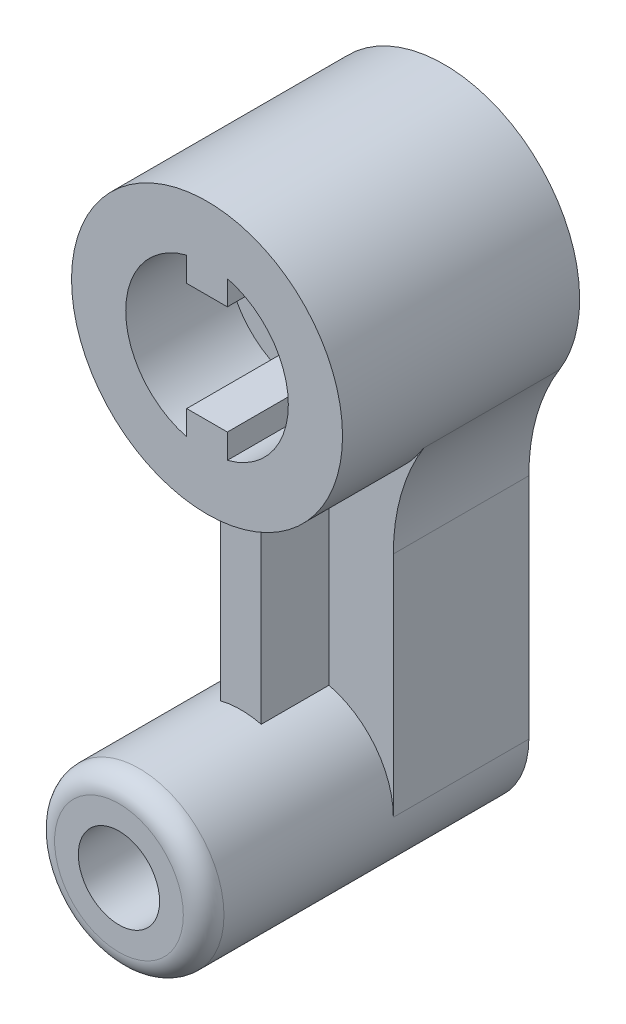
ISO-10303-21;
HEADER;
FILE_DESCRIPTION(('STEP AP214'),'2;1');
FILE_NAME('part.step','',(''),(''),'','','');
FILE_SCHEMA(('AUTOMOTIVE_DESIGN { 1 0 10303 214 1 1 1 1 }'));
ENDSEC;
DATA;
#1=APPLICATION_CONTEXT('core data for automotive mechanical design processes');
#2=APPLICATION_PROTOCOL_DEFINITION('international standard','automotive_design',2000,#1);
#3=PRODUCT_CONTEXT('',#1,'mechanical');
#4=PRODUCT('Part','Part','',(#3));
#5=PRODUCT_RELATED_PRODUCT_CATEGORY('part','',(#4));
#6=PRODUCT_DEFINITION_FORMATION('','',#4);
#7=PRODUCT_DEFINITION_CONTEXT('part definition',#1,'design');
#8=PRODUCT_DEFINITION('design','',#6,#7);
#9=PRODUCT_DEFINITION_SHAPE('','',#8);
#10=(LENGTH_UNIT() NAMED_UNIT(*) SI_UNIT(.MILLI.,.METRE.));
#11=(NAMED_UNIT(*) PLANE_ANGLE_UNIT() SI_UNIT($,.RADIAN.));
#12=(NAMED_UNIT(*) SI_UNIT($,.STERADIAN.) SOLID_ANGLE_UNIT());
#13=UNCERTAINTY_MEASURE_WITH_UNIT(LENGTH_MEASURE(1.E-05),#10,'distance_accuracy_value','');
#14=(GEOMETRIC_REPRESENTATION_CONTEXT(3) GLOBAL_UNCERTAINTY_ASSIGNED_CONTEXT((#13)) GLOBAL_UNIT_ASSIGNED_CONTEXT((#10,
#11,#12)) REPRESENTATION_CONTEXT('',''));
#15=CARTESIAN_POINT('',(0.,0.,0.));
#16=DIRECTION('',(0.,0.,1.));
#17=DIRECTION('',(1.,0.,0.));
#18=AXIS2_PLACEMENT_3D('',#15,#16,#17);
#19=CARTESIAN_POINT('',(-42.5,-26.3391343821318,20.));
#20=DIRECTION('',(0.,0.,1.));
#21=DIRECTION('',(1.,0.,0.));
#22=AXIS2_PLACEMENT_3D('',#19,#20,#21);
#23=PLANE('',#22);
#24=CARTESIAN_POINT('',(0.,-60.,20.));
#25=DIRECTION('',(0.,0.,-1.));
#26=DIRECTION('',(1.,0.,0.));
#27=AXIS2_PLACEMENT_3D('',#24,#25,#26);
#28=CIRCLE('',#27,12.5);
#29=CARTESIAN_POINT('',(-12.5,-60.,20.));
#30=VERTEX_POINT('',#29);
#31=CARTESIAN_POINT('',(-3.,-47.8653389004884,20.));
#32=VERTEX_POINT('',#31);
#33=EDGE_CURVE('E282',#30,#32,#28,.T.);
#34=ORIENTED_EDGE('',*,*,#33,.T.);
#35=DIRECTION('',(0.,1.,0.));
#36=VECTOR('',#35,1.);
#37=CARTESIAN_POINT('',(-3.,-26.3391343821318,20.));
#38=LINE('',#37,#36);
#39=CARTESIAN_POINT('',(-3.,-19.7737199332852,20.));
#40=VERTEX_POINT('',#39);
#41=EDGE_CURVE('E176',#32,#40,#38,.T.);
#42=ORIENTED_EDGE('',*,*,#41,.T.);
#43=CARTESIAN_POINT('',(0.,0.,20.));
#44=DIRECTION('',(0.,0.,-1.));
#45=DIRECTION('',(1.,0.,0.));
#46=AXIS2_PLACEMENT_3D('',#43,#44,#45);
#47=CIRCLE('',#46,20.);
#48=CARTESIAN_POINT('',(-17.,-10.5356537528527,20.));
#49=VERTEX_POINT('',#48);
#50=EDGE_CURVE('E288',#40,#49,#47,.T.);
#51=ORIENTED_EDGE('',*,*,#50,.T.);
#52=CARTESIAN_POINT('',(-42.5,-26.3391343821318,20.));
#53=DIRECTION('',(0.,0.,-1.));
#54=DIRECTION('',(1.,0.,0.));
#55=AXIS2_PLACEMENT_3D('',#52,#53,#54);
#56=CIRCLE('',#55,30.);
#57=CARTESIAN_POINT('',(-12.5,-26.3391343821319,20.));
#58=VERTEX_POINT('',#57);
#59=EDGE_CURVE('E275',#49,#58,#56,.T.);
#60=ORIENTED_EDGE('',*,*,#59,.T.);
#61=DIRECTION('',(0.,-1.,0.));
#62=VECTOR('',#61,1.);
#63=CARTESIAN_POINT('',(-12.5,-26.3391343821319,20.));
#64=LINE('',#63,#62);
#65=EDGE_CURVE('E278',#58,#30,#64,.T.);
#66=ORIENTED_EDGE('',*,*,#65,.T.);
#67=EDGE_LOOP('',(#34,#42,#51,#60,#66));
#68=FACE_BOUND('',#67,.T.);
#69=ADVANCED_FACE('F32',(#68),#23,.T.);
#70=CARTESIAN_POINT('',(-42.5,-26.3391343821318,20.));
#71=DIRECTION('',(0.,0.,-1.));
#72=DIRECTION('',(-1.,0.,0.));
#73=AXIS2_PLACEMENT_3D('',#70,#71,#72);
#74=CYLINDRICAL_SURFACE('',#73,30.);
#75=CARTESIAN_POINT('',(-42.5,-26.3391343821318,0.));
#76=DIRECTION('',(0.,0.,-1.));
#77=DIRECTION('',(1.,0.,0.));
#78=AXIS2_PLACEMENT_3D('',#75,#76,#77);
#79=CIRCLE('',#78,30.);
#80=CARTESIAN_POINT('',(-17.,-10.5356537528527,0.));
#81=VERTEX_POINT('',#80);
#82=CARTESIAN_POINT('',(-12.5,-26.3391343821319,0.));
#83=VERTEX_POINT('',#82);
#84=EDGE_CURVE('E273',#81,#83,#79,.T.);
#85=ORIENTED_EDGE('',*,*,#84,.T.);
#86=DIRECTION('',(0.,0.,-1.));
#87=VECTOR('',#86,1.);
#88=CARTESIAN_POINT('',(-12.5,-26.3391343821319,20.));
#89=LINE('',#88,#87);
#90=EDGE_CURVE('E314',#58,#83,#89,.T.);
#91=ORIENTED_EDGE('',*,*,#90,.F.);
#92=ORIENTED_EDGE('',*,*,#59,.F.);
#93=DIRECTION('',(0.,0.,-1.));
#94=VECTOR('',#93,1.);
#95=CARTESIAN_POINT('',(-17.,-10.5356537528527,20.));
#96=LINE('',#95,#94);
#97=EDGE_CURVE('E292',#49,#81,#96,.T.);
#98=ORIENTED_EDGE('',*,*,#97,.T.);
#99=EDGE_LOOP('',(#85,#91,#92,#98));
#100=FACE_BOUND('',#99,.T.);
#101=ADVANCED_FACE('F335',(#100),#74,.F.);
#102=CARTESIAN_POINT('',(-12.5,-26.3391343821319,20.));
#103=DIRECTION('',(1.,0.,0.));
#104=DIRECTION('',(0.,1.,0.));
#105=AXIS2_PLACEMENT_3D('',#102,#103,#104);
#106=PLANE('',#105);
#107=DIRECTION('',(0.,-1.,0.));
#108=VECTOR('',#107,1.);
#109=CARTESIAN_POINT('',(-12.5,-26.3391343821319,0.));
#110=LINE('',#109,#108);
#111=CARTESIAN_POINT('',(-12.5,-60.,0.));
#112=VERTEX_POINT('',#111);
#113=EDGE_CURVE('E295',#83,#112,#110,.T.);
#114=ORIENTED_EDGE('',*,*,#113,.T.);
#115=DIRECTION('',(0.,0.,-1.));
#116=VECTOR('',#115,1.);
#117=CARTESIAN_POINT('',(-12.5,-60.,20.));
#118=LINE('',#117,#116);
#119=EDGE_CURVE('E311',#30,#112,#118,.T.);
#120=ORIENTED_EDGE('',*,*,#119,.F.);
#121=ORIENTED_EDGE('',*,*,#65,.F.);
#122=ORIENTED_EDGE('',*,*,#90,.T.);
#123=EDGE_LOOP('',(#114,#120,#121,#122));
#124=FACE_BOUND('',#123,.T.);
#125=ADVANCED_FACE('F342',(#124),#106,.F.);
#126=CARTESIAN_POINT('',(12.5,-26.3391343821319,20.));
#127=DIRECTION('',(-1.,0.,0.));
#128=DIRECTION('',(0.,-1.,0.));
#129=AXIS2_PLACEMENT_3D('',#126,#127,#128);
#130=PLANE('',#129);
#131=DIRECTION('',(0.,1.,0.));
#132=VECTOR('',#131,1.);
#133=CARTESIAN_POINT('',(12.5,-26.3391343821319,0.));
#134=LINE('',#133,#132);
#135=CARTESIAN_POINT('',(12.5,-60.,0.));
#136=VERTEX_POINT('',#135);
#137=CARTESIAN_POINT('',(12.5,-26.3391343821319,0.));
#138=VERTEX_POINT('',#137);
#139=EDGE_CURVE('E297',#136,#138,#134,.T.);
#140=ORIENTED_EDGE('',*,*,#139,.T.);
#141=DIRECTION('',(0.,0.,-1.));
#142=VECTOR('',#141,1.);
#143=CARTESIAN_POINT('',(12.5,-26.3391343821319,20.));
#144=LINE('',#143,#142);
#145=CARTESIAN_POINT('',(12.5,-26.3391343821319,20.));
#146=VERTEX_POINT('',#145);
#147=EDGE_CURVE('E305',#146,#138,#144,.T.);
#148=ORIENTED_EDGE('',*,*,#147,.F.);
#149=DIRECTION('',(0.,1.,0.));
#150=VECTOR('',#149,1.);
#151=CARTESIAN_POINT('',(12.5,-26.3391343821319,20.));
#152=LINE('',#151,#150);
#153=CARTESIAN_POINT('',(12.5,-60.,20.));
#154=VERTEX_POINT('',#153);
#155=EDGE_CURVE('E284',#154,#146,#152,.T.);
#156=ORIENTED_EDGE('',*,*,#155,.F.);
#157=DIRECTION('',(0.,0.,-1.));
#158=VECTOR('',#157,1.);
#159=CARTESIAN_POINT('',(12.5,-60.,20.));
#160=LINE('',#159,#158);
#161=EDGE_CURVE('E308',#154,#136,#160,.T.);
#162=ORIENTED_EDGE('',*,*,#161,.T.);
#163=EDGE_LOOP('',(#140,#148,#156,#162));
#164=FACE_BOUND('',#163,.T.);
#165=ADVANCED_FACE('F356',(#164),#130,.F.);
#166=CARTESIAN_POINT('',(42.5,-26.3391343821318,20.));
#167=DIRECTION('',(0.,0.,-1.));
#168=DIRECTION('',(-1.,0.,0.));
#169=AXIS2_PLACEMENT_3D('',#166,#167,#168);
#170=CYLINDRICAL_SURFACE('',#169,30.);
#171=CARTESIAN_POINT('',(42.5,-26.3391343821318,0.));
#172=DIRECTION('',(0.,0.,-1.));
#173=DIRECTION('',(-1.,0.,0.));
#174=AXIS2_PLACEMENT_3D('',#171,#172,#173);
#175=CIRCLE('',#174,30.);
#176=CARTESIAN_POINT('',(17.,-10.5356537528527,0.));
#177=VERTEX_POINT('',#176);
#178=EDGE_CURVE('E279',#138,#177,#175,.T.);
#179=ORIENTED_EDGE('',*,*,#178,.T.);
#180=DIRECTION('',(0.,0.,-1.));
#181=VECTOR('',#180,1.);
#182=CARTESIAN_POINT('',(17.,-10.5356537528527,20.));
#183=LINE('',#182,#181);
#184=CARTESIAN_POINT('',(17.,-10.5356537528527,20.));
#185=VERTEX_POINT('',#184);
#186=EDGE_CURVE('E302',#185,#177,#183,.T.);
#187=ORIENTED_EDGE('',*,*,#186,.F.);
#188=CARTESIAN_POINT('',(42.5,-26.3391343821318,20.));
#189=DIRECTION('',(0.,0.,-1.));
#190=DIRECTION('',(-1.,0.,0.));
#191=AXIS2_PLACEMENT_3D('',#188,#189,#190);
#192=CIRCLE('',#191,30.);
#193=EDGE_CURVE('E286',#146,#185,#192,.T.);
#194=ORIENTED_EDGE('',*,*,#193,.F.);
#195=ORIENTED_EDGE('',*,*,#147,.T.);
#196=EDGE_LOOP('',(#179,#187,#194,#195));
#197=FACE_BOUND('',#196,.T.);
#198=ADVANCED_FACE('F348',(#197),#170,.F.);
#199=DIRECTION('',(0.,1.,0.));
#200=VECTOR('',#199,1.);
#201=CARTESIAN_POINT('',(3.,-26.3391343821318,20.));
#202=LINE('',#201,#200);
#203=CARTESIAN_POINT('',(3.,-47.8653389004884,20.));
#204=VERTEX_POINT('',#203);
#205=CARTESIAN_POINT('',(3.,-19.7737199332852,20.));
#206=VERTEX_POINT('',#205);
#207=EDGE_CURVE('E186',#204,#206,#202,.T.);
#208=ORIENTED_EDGE('',*,*,#207,.F.);
#209=EDGE_CURVE('E281',#204,#154,#28,.T.);
#210=ORIENTED_EDGE('',*,*,#209,.T.);
#211=ORIENTED_EDGE('',*,*,#155,.T.);
#212=ORIENTED_EDGE('',*,*,#193,.T.);
#213=EDGE_CURVE('E289',#185,#206,#47,.T.);
#214=ORIENTED_EDGE('',*,*,#213,.T.);
#215=EDGE_LOOP('',(#208,#210,#211,#212,#214));
#216=FACE_BOUND('',#215,.T.);
#217=ADVANCED_FACE('F338',(#216),#23,.T.);
#218=CARTESIAN_POINT('',(-42.5,-26.3391343821318,0.));
#219=DIRECTION('',(0.,0.,1.));
#220=DIRECTION('',(1.,0.,0.));
#221=AXIS2_PLACEMENT_3D('',#218,#219,#220);
#222=PLANE('',#221);
#223=CARTESIAN_POINT('',(0.,-60.,0.));
#224=DIRECTION('',(0.,0.,1.));
#225=DIRECTION('',(1.,0.,0.));
#226=AXIS2_PLACEMENT_3D('',#223,#224,#225);
#227=CIRCLE('',#226,6.);
#228=CARTESIAN_POINT('',(6.,-60.,0.));
#229=VERTEX_POINT('',#228);
#230=EDGE_CURVE('E191',#229,#229,#227,.T.);
#231=ORIENTED_EDGE('',*,*,#230,.T.);
#232=EDGE_LOOP('',(#231));
#233=FACE_BOUND('',#232,.T.);
#234=CARTESIAN_POINT('',(0.,0.,0.));
#235=DIRECTION('',(0.,0.,1.));
#236=DIRECTION('',(1.,0.,0.));
#237=AXIS2_PLACEMENT_3D('',#234,#235,#236);
#238=CIRCLE('',#237,4.);
#239=CARTESIAN_POINT('',(4.,0.,0.));
#240=VERTEX_POINT('',#239);
#241=EDGE_CURVE('E202',#240,#240,#238,.F.);
#242=ORIENTED_EDGE('',*,*,#241,.F.);
#243=EDGE_LOOP('',(#242));
#244=FACE_BOUND('',#243,.T.);
#245=ORIENTED_EDGE('',*,*,#139,.F.);
#246=CARTESIAN_POINT('',(0.,-60.,0.));
#247=DIRECTION('',(0.,0.,1.));
#248=DIRECTION('',(1.,0.,0.));
#249=AXIS2_PLACEMENT_3D('',#246,#247,#248);
#250=CIRCLE('',#249,12.5);
#251=EDGE_CURVE('E195',#112,#136,#250,.T.);
#252=ORIENTED_EDGE('',*,*,#251,.F.);
#253=ORIENTED_EDGE('',*,*,#113,.F.);
#254=ORIENTED_EDGE('',*,*,#84,.F.);
#255=CARTESIAN_POINT('',(0.,0.,0.));
#256=DIRECTION('',(0.,0.,1.));
#257=DIRECTION('',(1.,0.,0.));
#258=AXIS2_PLACEMENT_3D('',#255,#256,#257);
#259=CIRCLE('',#258,20.);
#260=EDGE_CURVE('E256',#177,#81,#259,.T.);
#261=ORIENTED_EDGE('',*,*,#260,.F.);
#262=ORIENTED_EDGE('',*,*,#178,.F.);
#263=EDGE_LOOP('',(#245,#252,#253,#254,#261,#262));
#264=FACE_BOUND('',#263,.T.);
#265=ADVANCED_FACE('F347',(#233,#244,#264),#222,.F.);
#266=CARTESIAN_POINT('',(0.,0.,35.));
#267=DIRECTION('',(0.,0.,-1.));
#268=DIRECTION('',(-1.,0.,0.));
#269=AXIS2_PLACEMENT_3D('',#266,#267,#268);
#270=CYLINDRICAL_SURFACE('',#269,20.);
#271=CARTESIAN_POINT('',(0.,0.,30.));
#272=DIRECTION('',(0.,0.,1.));
#273=DIRECTION('',(0.,-1.,0.));
#274=AXIS2_PLACEMENT_3D('',#271,#272,#273);
#275=CIRCLE('',#274,20.);
#276=CARTESIAN_POINT('',(-3.,-19.7737199332852,30.));
#277=VERTEX_POINT('',#276);
#278=CARTESIAN_POINT('',(3.,-19.7737199332852,30.));
#279=VERTEX_POINT('',#278);
#280=EDGE_CURVE('E47',#277,#279,#275,.T.);
#281=ORIENTED_EDGE('',*,*,#280,.T.);
#282=DIRECTION('',(0.,0.,-1.));
#283=VECTOR('',#282,1.);
#284=CARTESIAN_POINT('',(3.,-19.7737199332852,35.));
#285=LINE('',#284,#283);
#286=EDGE_CURVE('E169',#279,#206,#285,.T.);
#287=ORIENTED_EDGE('',*,*,#286,.T.);
#288=ORIENTED_EDGE('',*,*,#213,.F.);
#289=ORIENTED_EDGE('',*,*,#186,.T.);
#290=ORIENTED_EDGE('',*,*,#260,.T.);
#291=ORIENTED_EDGE('',*,*,#97,.F.);
#292=ORIENTED_EDGE('',*,*,#50,.F.);
#293=DIRECTION('',(0.,0.,-1.));
#294=VECTOR('',#293,1.);
#295=CARTESIAN_POINT('',(-3.,-19.7737199332852,35.));
#296=LINE('',#295,#294);
#297=EDGE_CURVE('E52',#277,#40,#296,.T.);
#298=ORIENTED_EDGE('',*,*,#297,.F.);
#299=EDGE_LOOP('',(#281,#287,#288,#289,#290,#291,#292,#298));
#300=FACE_BOUND('',#299,.T.);
#301=CARTESIAN_POINT('',(0.,0.,35.));
#302=DIRECTION('',(0.,0.,1.));
#303=DIRECTION('',(1.,0.,0.));
#304=AXIS2_PLACEMENT_3D('',#301,#302,#303);
#305=CIRCLE('',#304,20.);
#306=CARTESIAN_POINT('',(20.,0.,35.));
#307=VERTEX_POINT('',#306);
#308=EDGE_CURVE('E270',#307,#307,#305,.T.);
#309=ORIENTED_EDGE('',*,*,#308,.F.);
#310=EDGE_LOOP('',(#309));
#311=FACE_BOUND('',#310,.T.);
#312=ADVANCED_FACE('F354',(#300,#311),#270,.T.);
#313=CARTESIAN_POINT('',(0.,0.,35.));
#314=DIRECTION('',(0.,0.,1.));
#315=DIRECTION('',(1.,0.,0.));
#316=AXIS2_PLACEMENT_3D('',#313,#314,#315);
#317=PLANE('',#316);
#318=CARTESIAN_POINT('',(0.,0.,35.));
#319=DIRECTION('',(0.,0.,1.));
#320=DIRECTION('',(1.,0.,0.));
#321=AXIS2_PLACEMENT_3D('',#318,#319,#320);
#322=CIRCLE('',#321,12.);
#323=CARTESIAN_POINT('',(-3.,11.6189500386223,35.));
#324=VERTEX_POINT('',#323);
#325=CARTESIAN_POINT('',(-3.,-11.6189500386223,35.));
#326=VERTEX_POINT('',#325);
#327=EDGE_CURVE('E205',#324,#326,#322,.T.);
#328=ORIENTED_EDGE('',*,*,#327,.F.);
#329=DIRECTION('',(0.,1.,0.));
#330=VECTOR('',#329,1.);
#331=CARTESIAN_POINT('',(-3.,11.6189500386223,35.));
#332=LINE('',#331,#330);
#333=CARTESIAN_POINT('',(-3.,8.,35.));
#334=VERTEX_POINT('',#333);
#335=EDGE_CURVE('E210',#334,#324,#332,.T.);
#336=ORIENTED_EDGE('',*,*,#335,.F.);
#337=DIRECTION('',(-1.,0.,0.));
#338=VECTOR('',#337,1.);
#339=CARTESIAN_POINT('',(-3.,8.,35.));
#340=LINE('',#339,#338);
#341=CARTESIAN_POINT('',(3.,8.,35.));
#342=VERTEX_POINT('',#341);
#343=EDGE_CURVE('E249',#342,#334,#340,.T.);
#344=ORIENTED_EDGE('',*,*,#343,.F.);
#345=DIRECTION('',(0.,-1.,0.));
#346=VECTOR('',#345,1.);
#347=CARTESIAN_POINT('',(3.,8.,35.));
#348=LINE('',#347,#346);
#349=CARTESIAN_POINT('',(3.,11.6189500386223,35.));
#350=VERTEX_POINT('',#349);
#351=EDGE_CURVE('E246',#350,#342,#348,.T.);
#352=ORIENTED_EDGE('',*,*,#351,.F.);
#353=CARTESIAN_POINT('',(0.,0.,35.));
#354=DIRECTION('',(0.,0.,1.));
#355=DIRECTION('',(1.,0.,0.));
#356=AXIS2_PLACEMENT_3D('',#353,#354,#355);
#357=CIRCLE('',#356,12.);
#358=CARTESIAN_POINT('',(3.,-11.6189500386223,35.));
#359=VERTEX_POINT('',#358);
#360=EDGE_CURVE('E243',#359,#350,#357,.T.);
#361=ORIENTED_EDGE('',*,*,#360,.F.);
#362=DIRECTION('',(0.,-1.,0.));
#363=VECTOR('',#362,1.);
#364=CARTESIAN_POINT('',(3.,-8.,35.));
#365=LINE('',#364,#363);
#366=CARTESIAN_POINT('',(3.,-8.,35.));
#367=VERTEX_POINT('',#366);
#368=EDGE_CURVE('E240',#367,#359,#365,.T.);
#369=ORIENTED_EDGE('',*,*,#368,.F.);
#370=DIRECTION('',(1.,0.,0.));
#371=VECTOR('',#370,1.);
#372=CARTESIAN_POINT('',(-3.,-8.,35.));
#373=LINE('',#372,#371);
#374=CARTESIAN_POINT('',(-3.,-8.,35.));
#375=VERTEX_POINT('',#374);
#376=EDGE_CURVE('E237',#375,#367,#373,.T.);
#377=ORIENTED_EDGE('',*,*,#376,.F.);
#378=DIRECTION('',(0.,1.,0.));
#379=VECTOR('',#378,1.);
#380=CARTESIAN_POINT('',(-3.,-11.6189500386223,35.));
#381=LINE('',#380,#379);
#382=EDGE_CURVE('E234',#326,#375,#381,.T.);
#383=ORIENTED_EDGE('',*,*,#382,.F.);
#384=EDGE_LOOP('',(#328,#336,#344,#352,#361,#369,#377,#383));
#385=FACE_BOUND('',#384,.T.);
#386=ORIENTED_EDGE('',*,*,#308,.T.);
#387=EDGE_LOOP('',(#386));
#388=FACE_BOUND('',#387,.T.);
#389=ADVANCED_FACE('F404',(#385,#388),#317,.T.);
#390=CARTESIAN_POINT('',(0.,0.,20.));
#391=DIRECTION('',(0.,0.,1.));
#392=DIRECTION('',(1.,0.,0.));
#393=AXIS2_PLACEMENT_3D('',#390,#391,#392);
#394=CYLINDRICAL_SURFACE('',#393,12.);
#395=ORIENTED_EDGE('',*,*,#327,.T.);
#396=DIRECTION('',(0.,0.,1.));
#397=VECTOR('',#396,1.);
#398=CARTESIAN_POINT('',(-3.,-11.6189500386223,20.));
#399=LINE('',#398,#397);
#400=CARTESIAN_POINT('',(-3.,-11.6189500386223,20.));
#401=VERTEX_POINT('',#400);
#402=EDGE_CURVE('E231',#401,#326,#399,.T.);
#403=ORIENTED_EDGE('',*,*,#402,.F.);
#404=CARTESIAN_POINT('',(0.,0.,20.));
#405=DIRECTION('',(0.,0.,1.));
#406=DIRECTION('',(1.,0.,0.));
#407=AXIS2_PLACEMENT_3D('',#404,#405,#406);
#408=CIRCLE('',#407,12.);
#409=CARTESIAN_POINT('',(-3.,11.6189500386223,20.));
#410=VERTEX_POINT('',#409);
#411=EDGE_CURVE('E206',#410,#401,#408,.T.);
#412=ORIENTED_EDGE('',*,*,#411,.F.);
#413=DIRECTION('',(0.,0.,1.));
#414=VECTOR('',#413,1.);
#415=CARTESIAN_POINT('',(-3.,11.6189500386223,20.));
#416=LINE('',#415,#414);
#417=EDGE_CURVE('E254',#410,#324,#416,.T.);
#418=ORIENTED_EDGE('',*,*,#417,.T.);
#419=EDGE_LOOP('',(#395,#403,#412,#418));
#420=FACE_BOUND('',#419,.T.);
#421=ADVANCED_FACE('F408',(#420),#394,.F.);
#422=CARTESIAN_POINT('',(-3.,11.6189500386223,20.));
#423=DIRECTION('',(1.,0.,0.));
#424=DIRECTION('',(0.,1.,0.));
#425=AXIS2_PLACEMENT_3D('',#422,#423,#424);
#426=PLANE('',#425);
#427=ORIENTED_EDGE('',*,*,#335,.T.);
#428=ORIENTED_EDGE('',*,*,#417,.F.);
#429=DIRECTION('',(0.,1.,0.));
#430=VECTOR('',#429,1.);
#431=CARTESIAN_POINT('',(-3.,11.6189500386223,20.));
#432=LINE('',#431,#430);
#433=CARTESIAN_POINT('',(-3.,8.,20.));
#434=VERTEX_POINT('',#433);
#435=EDGE_CURVE('E228',#434,#410,#432,.T.);
#436=ORIENTED_EDGE('',*,*,#435,.F.);
#437=DIRECTION('',(0.,0.,1.));
#438=VECTOR('',#437,1.);
#439=CARTESIAN_POINT('',(-3.,8.,20.));
#440=LINE('',#439,#438);
#441=EDGE_CURVE('E257',#434,#334,#440,.T.);
#442=ORIENTED_EDGE('',*,*,#441,.T.);
#443=EDGE_LOOP('',(#427,#428,#436,#442));
#444=FACE_BOUND('',#443,.T.);
#445=ADVANCED_FACE('F423',(#444),#426,.F.);
#446=CARTESIAN_POINT('',(-3.,8.,20.));
#447=DIRECTION('',(0.,1.,0.));
#448=DIRECTION('',(0.,0.,1.));
#449=AXIS2_PLACEMENT_3D('',#446,#447,#448);
#450=PLANE('',#449);
#451=ORIENTED_EDGE('',*,*,#343,.T.);
#452=ORIENTED_EDGE('',*,*,#441,.F.);
#453=DIRECTION('',(-1.,0.,0.));
#454=VECTOR('',#453,1.);
#455=CARTESIAN_POINT('',(-3.,8.,20.));
#456=LINE('',#455,#454);
#457=CARTESIAN_POINT('',(3.,8.,20.));
#458=VERTEX_POINT('',#457);
#459=EDGE_CURVE('E225',#458,#434,#456,.T.);
#460=ORIENTED_EDGE('',*,*,#459,.F.);
#461=DIRECTION('',(0.,0.,1.));
#462=VECTOR('',#461,1.);
#463=CARTESIAN_POINT('',(3.,8.,20.));
#464=LINE('',#463,#462);
#465=EDGE_CURVE('E259',#458,#342,#464,.T.);
#466=ORIENTED_EDGE('',*,*,#465,.T.);
#467=EDGE_LOOP('',(#451,#452,#460,#466));
#468=FACE_BOUND('',#467,.T.);
#469=ADVANCED_FACE('F430',(#468),#450,.F.);
#470=CARTESIAN_POINT('',(3.,8.,20.));
#471=DIRECTION('',(-1.,0.,0.));
#472=DIRECTION('',(0.,-1.,0.));
#473=AXIS2_PLACEMENT_3D('',#470,#471,#472);
#474=PLANE('',#473);
#475=DIRECTION('',(0.,0.,1.));
#476=VECTOR('',#475,1.);
#477=CARTESIAN_POINT('',(3.,11.6189500386223,20.));
#478=LINE('',#477,#476);
#479=CARTESIAN_POINT('',(3.,11.6189500386223,20.));
#480=VERTEX_POINT('',#479);
#481=EDGE_CURVE('E261',#480,#350,#478,.T.);
#482=ORIENTED_EDGE('',*,*,#481,.T.);
#483=ORIENTED_EDGE('',*,*,#351,.T.);
#484=ORIENTED_EDGE('',*,*,#465,.F.);
#485=DIRECTION('',(0.,-1.,0.));
#486=VECTOR('',#485,1.);
#487=CARTESIAN_POINT('',(3.,8.,20.));
#488=LINE('',#487,#486);
#489=EDGE_CURVE('E222',#480,#458,#488,.T.);
#490=ORIENTED_EDGE('',*,*,#489,.F.);
#491=EDGE_LOOP('',(#482,#483,#484,#490));
#492=FACE_BOUND('',#491,.T.);
#493=ADVANCED_FACE('F438',(#492),#474,.F.);
#494=CARTESIAN_POINT('',(0.,0.,20.));
#495=DIRECTION('',(0.,0.,1.));
#496=DIRECTION('',(1.,0.,0.));
#497=AXIS2_PLACEMENT_3D('',#494,#495,#496);
#498=CYLINDRICAL_SURFACE('',#497,12.);
#499=ORIENTED_EDGE('',*,*,#360,.T.);
#500=ORIENTED_EDGE('',*,*,#481,.F.);
#501=CARTESIAN_POINT('',(0.,0.,20.));
#502=DIRECTION('',(0.,0.,1.));
#503=DIRECTION('',(1.,0.,0.));
#504=AXIS2_PLACEMENT_3D('',#501,#502,#503);
#505=CIRCLE('',#504,12.);
#506=CARTESIAN_POINT('',(3.,-11.6189500386223,20.));
#507=VERTEX_POINT('',#506);
#508=EDGE_CURVE('E219',#507,#480,#505,.T.);
#509=ORIENTED_EDGE('',*,*,#508,.F.);
#510=DIRECTION('',(0.,0.,1.));
#511=VECTOR('',#510,1.);
#512=CARTESIAN_POINT('',(3.,-11.6189500386223,20.));
#513=LINE('',#512,#511);
#514=EDGE_CURVE('E263',#507,#359,#513,.T.);
#515=ORIENTED_EDGE('',*,*,#514,.T.);
#516=EDGE_LOOP('',(#499,#500,#509,#515));
#517=FACE_BOUND('',#516,.T.);
#518=ADVANCED_FACE('F446',(#517),#498,.F.);
#519=CARTESIAN_POINT('',(3.,-8.,20.));
#520=DIRECTION('',(-1.,0.,0.));
#521=DIRECTION('',(0.,-1.,0.));
#522=AXIS2_PLACEMENT_3D('',#519,#520,#521);
#523=PLANE('',#522);
#524=DIRECTION('',(0.,0.,1.));
#525=VECTOR('',#524,1.);
#526=CARTESIAN_POINT('',(3.,-8.,20.));
#527=LINE('',#526,#525);
#528=CARTESIAN_POINT('',(3.,-8.,20.));
#529=VERTEX_POINT('',#528);
#530=EDGE_CURVE('E265',#529,#367,#527,.T.);
#531=ORIENTED_EDGE('',*,*,#530,.T.);
#532=ORIENTED_EDGE('',*,*,#368,.T.);
#533=ORIENTED_EDGE('',*,*,#514,.F.);
#534=DIRECTION('',(0.,-1.,0.));
#535=VECTOR('',#534,1.);
#536=CARTESIAN_POINT('',(3.,-8.,20.));
#537=LINE('',#536,#535);
#538=EDGE_CURVE('E216',#529,#507,#537,.T.);
#539=ORIENTED_EDGE('',*,*,#538,.F.);
#540=EDGE_LOOP('',(#531,#532,#533,#539));
#541=FACE_BOUND('',#540,.T.);
#542=ADVANCED_FACE('F454',(#541),#523,.F.);
#543=CARTESIAN_POINT('',(-3.,-8.,20.));
#544=DIRECTION('',(0.,-1.,0.));
#545=DIRECTION('',(0.,0.,-1.));
#546=AXIS2_PLACEMENT_3D('',#543,#544,#545);
#547=PLANE('',#546);
#548=ORIENTED_EDGE('',*,*,#376,.T.);
#549=ORIENTED_EDGE('',*,*,#530,.F.);
#550=DIRECTION('',(1.,0.,0.));
#551=VECTOR('',#550,1.);
#552=CARTESIAN_POINT('',(-3.,-8.,20.));
#553=LINE('',#552,#551);
#554=CARTESIAN_POINT('',(-3.,-8.,20.));
#555=VERTEX_POINT('',#554);
#556=EDGE_CURVE('E213',#555,#529,#553,.T.);
#557=ORIENTED_EDGE('',*,*,#556,.F.);
#558=DIRECTION('',(0.,0.,1.));
#559=VECTOR('',#558,1.);
#560=CARTESIAN_POINT('',(-3.,-8.,20.));
#561=LINE('',#560,#559);
#562=EDGE_CURVE('E267',#555,#375,#561,.T.);
#563=ORIENTED_EDGE('',*,*,#562,.T.);
#564=EDGE_LOOP('',(#548,#549,#557,#563));
#565=FACE_BOUND('',#564,.T.);
#566=ADVANCED_FACE('F462',(#565),#547,.F.);
#567=CARTESIAN_POINT('',(-3.,-11.6189500386223,20.));
#568=DIRECTION('',(1.,0.,0.));
#569=DIRECTION('',(0.,1.,0.));
#570=AXIS2_PLACEMENT_3D('',#567,#568,#569);
#571=PLANE('',#570);
#572=ORIENTED_EDGE('',*,*,#382,.T.);
#573=ORIENTED_EDGE('',*,*,#562,.F.);
#574=DIRECTION('',(0.,1.,0.));
#575=VECTOR('',#574,1.);
#576=CARTESIAN_POINT('',(-3.,-11.6189500386223,20.));
#577=LINE('',#576,#575);
#578=EDGE_CURVE('E209',#401,#555,#577,.T.);
#579=ORIENTED_EDGE('',*,*,#578,.F.);
#580=ORIENTED_EDGE('',*,*,#402,.T.);
#581=EDGE_LOOP('',(#572,#573,#579,#580));
#582=FACE_BOUND('',#581,.T.);
#583=ADVANCED_FACE('F470',(#582),#571,.F.);
#584=CARTESIAN_POINT('',(0.,0.,20.));
#585=DIRECTION('',(0.,0.,1.));
#586=DIRECTION('',(1.,0.,0.));
#587=AXIS2_PLACEMENT_3D('',#584,#585,#586);
#588=PLANE('',#587);
#589=CARTESIAN_POINT('',(0.,0.,20.));
#590=DIRECTION('',(0.,0.,1.));
#591=DIRECTION('',(1.,0.,0.));
#592=AXIS2_PLACEMENT_3D('',#589,#590,#591);
#593=CIRCLE('',#592,4.);
#594=CARTESIAN_POINT('',(4.,0.,20.));
#595=VERTEX_POINT('',#594);
#596=EDGE_CURVE('E199',#595,#595,#593,.T.);
#597=ORIENTED_EDGE('',*,*,#596,.F.);
#598=EDGE_LOOP('',(#597));
#599=FACE_BOUND('',#598,.T.);
#600=ORIENTED_EDGE('',*,*,#556,.T.);
#601=ORIENTED_EDGE('',*,*,#538,.T.);
#602=ORIENTED_EDGE('',*,*,#508,.T.);
#603=ORIENTED_EDGE('',*,*,#489,.T.);
#604=ORIENTED_EDGE('',*,*,#459,.T.);
#605=ORIENTED_EDGE('',*,*,#435,.T.);
#606=ORIENTED_EDGE('',*,*,#411,.T.);
#607=ORIENTED_EDGE('',*,*,#578,.T.);
#608=EDGE_LOOP('',(#600,#601,#602,#603,#604,#605,#606,#607));
#609=FACE_BOUND('',#608,.T.);
#610=ADVANCED_FACE('F478',(#599,#609),#588,.T.);
#611=CARTESIAN_POINT('',(0.,0.,-0.001000000000001));
#612=DIRECTION('',(0.,0.,1.));
#613=DIRECTION('',(1.,0.,0.));
#614=AXIS2_PLACEMENT_3D('',#611,#612,#613);
#615=CYLINDRICAL_SURFACE('',#614,4.);
#616=CARTESIAN_POINT('',(4.,0.,0.));
#617=CARTESIAN_POINT('',(4.,0.,0.208333333333334));
#618=CARTESIAN_POINT('',(4.,0.,0.416666666666667));
#619=CARTESIAN_POINT('',(4.,0.,0.833333333333333));
#620=CARTESIAN_POINT('',(4.,0.,1.04166666666667));
#621=CARTESIAN_POINT('',(4.,0.,1.45833333333333));
#622=CARTESIAN_POINT('',(4.,0.,1.66666666666667));
#623=CARTESIAN_POINT('',(4.,0.,2.08333333333333));
#624=CARTESIAN_POINT('',(4.,0.,2.29166666666667));
#625=CARTESIAN_POINT('',(4.,0.,2.70833333333333));
#626=CARTESIAN_POINT('',(4.,0.,2.91666666666667));
#627=CARTESIAN_POINT('',(4.,0.,3.33333333333333));
#628=CARTESIAN_POINT('',(4.,0.,3.54166666666667));
#629=CARTESIAN_POINT('',(4.,0.,3.95833333333333));
#630=CARTESIAN_POINT('',(4.,0.,4.16666666666667));
#631=CARTESIAN_POINT('',(4.,0.,4.58333333333333));
#632=CARTESIAN_POINT('',(4.,0.,4.79166666666667));
#633=CARTESIAN_POINT('',(4.,0.,5.20833333333333));
#634=CARTESIAN_POINT('',(4.,0.,5.41666666666667));
#635=CARTESIAN_POINT('',(4.,0.,5.83333333333333));
#636=CARTESIAN_POINT('',(4.,0.,6.04166666666667));
#637=CARTESIAN_POINT('',(4.,0.,6.45833333333333));
#638=CARTESIAN_POINT('',(4.,0.,6.66666666666667));
#639=CARTESIAN_POINT('',(4.,0.,7.08333333333333));
#640=CARTESIAN_POINT('',(4.,0.,7.29166666666667));
#641=CARTESIAN_POINT('',(4.,0.,7.70833333333333));
#642=CARTESIAN_POINT('',(4.,0.,7.91666666666667));
#643=CARTESIAN_POINT('',(4.,0.,8.33333333333333));
#644=CARTESIAN_POINT('',(4.,0.,8.54166666666667));
#645=CARTESIAN_POINT('',(4.,0.,8.95833333333333));
#646=CARTESIAN_POINT('',(4.,0.,9.16666666666667));
#647=CARTESIAN_POINT('',(4.,0.,9.58333333333333));
#648=CARTESIAN_POINT('',(4.,0.,9.79166666666667));
#649=CARTESIAN_POINT('',(4.,0.,10.2083333333333));
#650=CARTESIAN_POINT('',(4.,0.,10.4166666666667));
#651=CARTESIAN_POINT('',(4.,0.,10.8333333333333));
#652=CARTESIAN_POINT('',(4.,0.,11.0416666666667));
#653=CARTESIAN_POINT('',(4.,0.,11.4583333333333));
#654=CARTESIAN_POINT('',(4.,0.,11.6666666666667));
#655=CARTESIAN_POINT('',(4.,0.,12.0833333333333));
#656=CARTESIAN_POINT('',(4.,0.,12.2916666666667));
#657=CARTESIAN_POINT('',(4.,0.,12.7083333333333));
#658=CARTESIAN_POINT('',(4.,0.,12.9166666666667));
#659=CARTESIAN_POINT('',(4.,0.,13.3333333333333));
#660=CARTESIAN_POINT('',(4.,0.,13.5416666666667));
#661=CARTESIAN_POINT('',(4.,0.,13.9583333333333));
#662=CARTESIAN_POINT('',(4.,0.,14.1666666666667));
#663=CARTESIAN_POINT('',(4.,0.,14.5833333333333));
#664=CARTESIAN_POINT('',(4.,0.,14.7916666666667));
#665=CARTESIAN_POINT('',(4.,0.,15.2083333333333));
#666=CARTESIAN_POINT('',(4.,0.,15.4166666666667));
#667=CARTESIAN_POINT('',(4.,0.,15.8333333333333));
#668=CARTESIAN_POINT('',(4.,0.,16.0416666666667));
#669=CARTESIAN_POINT('',(4.,0.,16.4583333333333));
#670=CARTESIAN_POINT('',(4.,0.,16.6666666666667));
#671=CARTESIAN_POINT('',(4.,0.,17.0833333333333));
#672=CARTESIAN_POINT('',(4.,0.,17.2916666666667));
#673=CARTESIAN_POINT('',(4.,0.,17.7083333333333));
#674=CARTESIAN_POINT('',(4.,0.,17.9166666666667));
#675=CARTESIAN_POINT('',(4.,0.,18.3333333333333));
#676=CARTESIAN_POINT('',(4.,0.,18.5416666666667));
#677=CARTESIAN_POINT('',(4.,0.,18.9583333333333));
#678=CARTESIAN_POINT('',(4.,0.,19.1666666666667));
#679=CARTESIAN_POINT('',(4.,0.,19.5833333333333));
#680=CARTESIAN_POINT('',(4.,0.,19.7916666666667));
#681=CARTESIAN_POINT('',(4.,0.,20.));
#682=B_SPLINE_CURVE_WITH_KNOTS('',3,(#616,#617,#618,#619,#620,#621,#622,#623,#624,#625,#626,
#627,#628,#629,#630,#631,#632,#633,#634,#635,#636,#637,#638,#639,#640,#641,#642,#643,#644,#645,
#646,#647,#648,#649,#650,#651,#652,#653,#654,#655,#656,#657,#658,#659,#660,#661,#662,#663,#664,
#665,#666,#667,#668,#669,#670,#671,#672,#673,#674,#675,#676,#677,#678,#679,#680,#681),
.UNSPECIFIED.,.F.,.F.,(4,2,2,2,2,2,2,2,2,2,2,2,2,2,2,2,2,2,2,2,2,2,2,2,2,2,2,2,2,2,2,2,4),(0.,
0.625,1.25,1.875,2.5,3.125,3.75,4.375,5.,5.625,6.25,6.875,7.5,8.125,8.75,9.375,10.,10.625,11.25,
11.875,12.5,13.125,13.75,14.375,15.,15.625,16.25,16.875,17.5,18.125,18.75,19.375,20.),.UNSPECIFIED.);
#683=EDGE_CURVE('BSEAM486',#240,#595,#682,.T.);
#684=ORIENTED_EDGE('',*,*,#241,.T.);
#685=ORIENTED_EDGE('',*,*,#596,.T.);
#686=ORIENTED_EDGE('',*,*,#683,.T.);
#687=ORIENTED_EDGE('',*,*,#683,.F.);
#688=EDGE_LOOP('',(#684,#686,#685,#687));
#689=FACE_BOUND('',#688,.T.);
#690=ADVANCED_FACE('F486',(#689),#615,.F.);
#691=CARTESIAN_POINT('',(0.,-60.,48.));
#692=DIRECTION('',(0.,0.,1.));
#693=DIRECTION('',(1.,0.,0.));
#694=AXIS2_PLACEMENT_3D('',#691,#692,#693);
#695=PLANE('',#694);
#696=CARTESIAN_POINT('',(0.,-60.,48.));
#697=DIRECTION('',(0.,0.,1.));
#698=DIRECTION('',(1.,0.,0.));
#699=AXIS2_PLACEMENT_3D('',#696,#697,#698);
#700=CIRCLE('',#699,9.5);
#701=CARTESIAN_POINT('',(9.5,-60.,48.));
#702=VERTEX_POINT('',#701);
#703=EDGE_CURVE('E40',#702,#702,#700,.T.);
#704=ORIENTED_EDGE('',*,*,#703,.T.);
#705=EDGE_LOOP('',(#704));
#706=FACE_BOUND('',#705,.T.);
#707=CARTESIAN_POINT('',(0.,-60.,48.));
#708=DIRECTION('',(0.,0.,1.));
#709=DIRECTION('',(1.,0.,0.));
#710=AXIS2_PLACEMENT_3D('',#707,#708,#709);
#711=CIRCLE('',#710,6.);
#712=CARTESIAN_POINT('',(6.,-60.,48.));
#713=VERTEX_POINT('',#712);
#714=EDGE_CURVE('E192',#713,#713,#711,.T.);
#715=ORIENTED_EDGE('',*,*,#714,.F.);
#716=EDGE_LOOP('',(#715));
#717=FACE_BOUND('',#716,.T.);
#718=ADVANCED_FACE('F319',(#706,#717),#695,.T.);
#719=CARTESIAN_POINT('',(0.,-60.,48.));
#720=DIRECTION('',(0.,0.,-1.));
#721=DIRECTION('',(-1.,0.,0.));
#722=AXIS2_PLACEMENT_3D('',#719,#720,#721);
#723=CYLINDRICAL_SURFACE('',#722,12.5);
#724=ORIENTED_EDGE('',*,*,#251,.T.);
#725=ORIENTED_EDGE('',*,*,#161,.F.);
#726=ORIENTED_EDGE('',*,*,#209,.F.);
#727=DIRECTION('',(0.,0.,-1.));
#728=VECTOR('',#727,1.);
#729=CARTESIAN_POINT('',(3.,-47.8653389004884,48.));
#730=LINE('',#729,#728);
#731=CARTESIAN_POINT('',(3.,-47.8653389004884,30.));
#732=VERTEX_POINT('',#731);
#733=EDGE_CURVE('E164',#204,#732,#730,.F.);
#734=ORIENTED_EDGE('',*,*,#733,.T.);
#735=CARTESIAN_POINT('',(0.,-60.,30.));
#736=DIRECTION('',(0.,0.,1.));
#737=DIRECTION('',(0.,-1.,0.));
#738=AXIS2_PLACEMENT_3D('',#735,#736,#737);
#739=CIRCLE('',#738,12.5);
#740=CARTESIAN_POINT('',(-3.,-47.8653389004884,30.));
#741=VERTEX_POINT('',#740);
#742=EDGE_CURVE('E155',#732,#741,#739,.T.);
#743=ORIENTED_EDGE('',*,*,#742,.T.);
#744=DIRECTION('',(0.,0.,-1.));
#745=VECTOR('',#744,1.);
#746=CARTESIAN_POINT('',(-3.,-47.8653389004884,48.));
#747=LINE('',#746,#745);
#748=EDGE_CURVE('E160',#32,#741,#747,.F.);
#749=ORIENTED_EDGE('',*,*,#748,.F.);
#750=ORIENTED_EDGE('',*,*,#33,.F.);
#751=ORIENTED_EDGE('',*,*,#119,.T.);
#752=EDGE_LOOP('',(#724,#725,#726,#734,#743,#749,#750,#751));
#753=FACE_BOUND('',#752,.T.);
#754=CARTESIAN_POINT('',(0.,-60.,45.));
#755=DIRECTION('',(0.,0.,1.));
#756=DIRECTION('',(1.,0.,0.));
#757=AXIS2_PLACEMENT_3D('',#754,#755,#756);
#758=CIRCLE('',#757,12.5);
#759=CARTESIAN_POINT('',(12.5,-60.,45.));
#760=VERTEX_POINT('',#759);
#761=EDGE_CURVE('E11',#760,#760,#758,.F.);
#762=ORIENTED_EDGE('',*,*,#761,.T.);
#763=EDGE_LOOP('',(#762));
#764=FACE_BOUND('',#763,.T.);
#765=ADVANCED_FACE('F157',(#753,#764),#723,.T.);
#766=CARTESIAN_POINT('',(0.,-60.,48.));
#767=DIRECTION('',(0.,0.,-1.));
#768=DIRECTION('',(-1.,0.,0.));
#769=AXIS2_PLACEMENT_3D('',#766,#767,#768);
#770=CYLINDRICAL_SURFACE('',#769,6.);
#771=ORIENTED_EDGE('',*,*,#230,.F.);
#772=EDGE_LOOP('',(#771));
#773=FACE_BOUND('',#772,.T.);
#774=ORIENTED_EDGE('',*,*,#714,.T.);
#775=EDGE_LOOP('',(#774));
#776=FACE_BOUND('',#775,.T.);
#777=ADVANCED_FACE('F323',(#773,#776),#770,.F.);
#778=CARTESIAN_POINT('',(0.,-60.,45.));
#779=DIRECTION('',(0.,0.,1.));
#780=DIRECTION('',(1.,0.,0.));
#781=AXIS2_PLACEMENT_3D('',#778,#779,#780);
#782=TOROIDAL_SURFACE('',#781,9.5,3.);
#783=ORIENTED_EDGE('',*,*,#761,.F.);
#784=EDGE_LOOP('',(#783));
#785=FACE_BOUND('',#784,.T.);
#786=ORIENTED_EDGE('',*,*,#703,.F.);
#787=EDGE_LOOP('',(#786));
#788=FACE_BOUND('',#787,.T.);
#789=ADVANCED_FACE('F34',(#785,#788),#782,.T.);
#790=CARTESIAN_POINT('',(0.,-20.,30.));
#791=DIRECTION('',(0.,0.,1.));
#792=DIRECTION('',(0.,-1.,0.));
#793=AXIS2_PLACEMENT_3D('',#790,#791,#792);
#794=PLANE('',#793);
#795=ORIENTED_EDGE('',*,*,#280,.F.);
#796=DIRECTION('',(0.,1.,0.));
#797=VECTOR('',#796,1.);
#798=CARTESIAN_POINT('',(-3.,-26.25,30.));
#799=LINE('',#798,#797);
#800=EDGE_CURVE('E175',#277,#741,#799,.F.);
#801=ORIENTED_EDGE('',*,*,#800,.T.);
#802=ORIENTED_EDGE('',*,*,#742,.F.);
#803=DIRECTION('',(0.,1.,0.));
#804=VECTOR('',#803,1.);
#805=CARTESIAN_POINT('',(3.,-26.25,30.));
#806=LINE('',#805,#804);
#807=EDGE_CURVE('E177',#279,#732,#806,.F.);
#808=ORIENTED_EDGE('',*,*,#807,.F.);
#809=EDGE_LOOP('',(#795,#801,#802,#808));
#810=FACE_BOUND('',#809,.T.);
#811=ADVANCED_FACE('F179',(#810),#794,.T.);
#812=CARTESIAN_POINT('',(3.,-26.25,24.));
#813=DIRECTION('',(1.,0.,0.));
#814=DIRECTION('',(0.,0.,-1.));
#815=AXIS2_PLACEMENT_3D('',#812,#813,#814);
#816=PLANE('',#815);
#817=ORIENTED_EDGE('',*,*,#286,.F.);
#818=ORIENTED_EDGE('',*,*,#807,.T.);
#819=ORIENTED_EDGE('',*,*,#733,.F.);
#820=ORIENTED_EDGE('',*,*,#207,.T.);
#821=EDGE_LOOP('',(#817,#818,#819,#820));
#822=FACE_BOUND('',#821,.T.);
#823=ADVANCED_FACE('F329',(#822),#816,.T.);
#824=CARTESIAN_POINT('',(-3.,-26.25,24.));
#825=DIRECTION('',(1.,0.,0.));
#826=DIRECTION('',(0.,0.,-1.));
#827=AXIS2_PLACEMENT_3D('',#824,#825,#826);
#828=PLANE('',#827);
#829=ORIENTED_EDGE('',*,*,#800,.F.);
#830=ORIENTED_EDGE('',*,*,#297,.T.);
#831=ORIENTED_EDGE('',*,*,#41,.F.);
#832=ORIENTED_EDGE('',*,*,#748,.T.);
#833=EDGE_LOOP('',(#829,#830,#831,#832));
#834=FACE_BOUND('',#833,.T.);
#835=ADVANCED_FACE('F174',(#834),#828,.F.);
#836=CLOSED_SHELL('',(#69,#101,#125,#165,#198,#217,#265,#312,#389,#421,#445,#469,#493,#518,#542,
#566,#583,#610,#690,#718,#765,#777,#789,#811,#823,#835));
#837=MANIFOLD_SOLID_BREP('B2',#836);
#838=ADVANCED_BREP_SHAPE_REPRESENTATION('',(#18,#837),#14);
#839=SHAPE_DEFINITION_REPRESENTATION(#9,#838);
ENDSEC;
END-ISO-10303-21;
